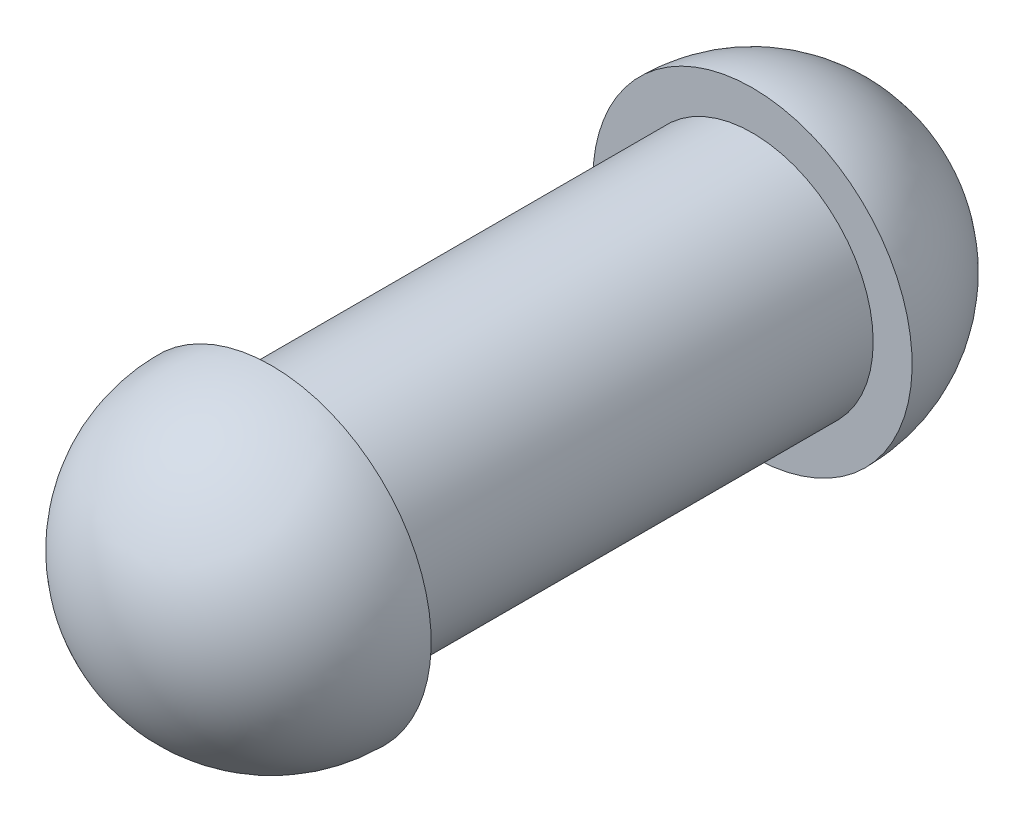
ISO-10303-21;
HEADER;
FILE_DESCRIPTION(('STEP AP214'),'2;1');
FILE_NAME('part.step','',(''),(''),'','','');
FILE_SCHEMA(('AUTOMOTIVE_DESIGN { 1 0 10303 214 1 1 1 1 }'));
ENDSEC;
DATA;
#1=APPLICATION_CONTEXT('core data for automotive mechanical design processes');
#2=APPLICATION_PROTOCOL_DEFINITION('international standard','automotive_design',2000,#1);
#3=PRODUCT_CONTEXT('',#1,'mechanical');
#4=PRODUCT('Part','Part','',(#3));
#5=PRODUCT_RELATED_PRODUCT_CATEGORY('part','',(#4));
#6=PRODUCT_DEFINITION_FORMATION('','',#4);
#7=PRODUCT_DEFINITION_CONTEXT('part definition',#1,'design');
#8=PRODUCT_DEFINITION('design','',#6,#7);
#9=PRODUCT_DEFINITION_SHAPE('','',#8);
#10=(LENGTH_UNIT() NAMED_UNIT(*) SI_UNIT(.MILLI.,.METRE.));
#11=(NAMED_UNIT(*) PLANE_ANGLE_UNIT() SI_UNIT($,.RADIAN.));
#12=(NAMED_UNIT(*) SI_UNIT($,.STERADIAN.) SOLID_ANGLE_UNIT());
#13=UNCERTAINTY_MEASURE_WITH_UNIT(LENGTH_MEASURE(1.E-05),#10,'distance_accuracy_value','');
#14=(GEOMETRIC_REPRESENTATION_CONTEXT(3) GLOBAL_UNCERTAINTY_ASSIGNED_CONTEXT((#13)) GLOBAL_UNIT_ASSIGNED_CONTEXT((#10,
#11,#12)) REPRESENTATION_CONTEXT('',''));
#15=CARTESIAN_POINT('',(0.,0.,0.));
#16=DIRECTION('',(0.,0.,1.));
#17=DIRECTION('',(1.,0.,0.));
#18=AXIS2_PLACEMENT_3D('',#15,#16,#17);
#19=CARTESIAN_POINT('',(0.,0.,30.875));
#20=DIRECTION('',(0.,0.,-1.));
#21=DIRECTION('',(-1.,0.,0.));
#22=AXIS2_PLACEMENT_3D('',#19,#20,#21);
#23=CYLINDRICAL_SURFACE('',#22,15.5);
#24=CARTESIAN_POINT('',(0.,0.,30.875));
#25=DIRECTION('',(0.,0.,1.));
#26=DIRECTION('',(1.,0.,0.));
#27=AXIS2_PLACEMENT_3D('',#24,#25,#26);
#28=CIRCLE('',#27,15.5);
#29=CARTESIAN_POINT('',(15.5,0.,30.875));
#30=VERTEX_POINT('',#29);
#31=EDGE_CURVE('E10',#30,#30,#28,.T.);
#32=ORIENTED_EDGE('',*,*,#31,.F.);
#33=EDGE_LOOP('',(#32));
#34=FACE_BOUND('',#33,.T.);
#35=CARTESIAN_POINT('',(0.,0.,-30.875));
#36=DIRECTION('',(0.,0.,1.));
#37=DIRECTION('',(1.,0.,0.));
#38=AXIS2_PLACEMENT_3D('',#35,#36,#37);
#39=CIRCLE('',#38,15.5);
#40=CARTESIAN_POINT('',(15.5,0.,-30.875));
#41=VERTEX_POINT('',#40);
#42=EDGE_CURVE('E47',#41,#41,#39,.T.);
#43=ORIENTED_EDGE('',*,*,#42,.T.);
#44=EDGE_LOOP('',(#43));
#45=FACE_BOUND('',#44,.T.);
#46=ADVANCED_FACE('F37',(#34,#45),#23,.T.);
#47=CARTESIAN_POINT('',(0.,0.,30.875));
#48=DIRECTION('',(0.,0.,-1.));
#49=DIRECTION('',(-1.,0.,0.));
#50=AXIS2_PLACEMENT_3D('',#47,#48,#49);
#51=PLANE('',#50);
#52=ORIENTED_EDGE('',*,*,#31,.T.);
#53=EDGE_LOOP('',(#52));
#54=FACE_BOUND('',#53,.T.);
#55=CARTESIAN_POINT('',(0.,0.,30.875));
#56=DIRECTION('',(0.,0.,-1.));
#57=DIRECTION('',(-1.,0.,0.));
#58=AXIS2_PLACEMENT_3D('',#55,#56,#57);
#59=CIRCLE('',#58,20.5);
#60=CARTESIAN_POINT('',(-20.5,0.,30.875));
#61=VERTEX_POINT('',#60);
#62=EDGE_CURVE('E43',#61,#61,#59,.T.);
#63=ORIENTED_EDGE('',*,*,#62,.T.);
#64=EDGE_LOOP('',(#63));
#65=FACE_BOUND('',#64,.T.);
#66=ADVANCED_FACE('F69',(#54,#65),#51,.T.);
#67=CARTESIAN_POINT('',(0.,0.,30.875));
#68=DIRECTION('',(0.,0.,-1.));
#69=DIRECTION('',(0.,1.,0.));
#70=AXIS2_PLACEMENT_3D('',#67,#68,#69);
#71=SPHERICAL_SURFACE('',#70,20.5);
#72=ORIENTED_EDGE('',*,*,#62,.F.);
#73=EDGE_LOOP('',(#72));
#74=FACE_BOUND('',#73,.T.);
#75=ADVANCED_FACE('F61',(#74),#71,.T.);
#76=CARTESIAN_POINT('',(0.,0.,-30.875));
#77=DIRECTION('',(0.,0.,1.));
#78=DIRECTION('',(-1.,0.,0.));
#79=AXIS2_PLACEMENT_3D('',#76,#77,#78);
#80=PLANE('',#79);
#81=ORIENTED_EDGE('',*,*,#42,.F.);
#82=EDGE_LOOP('',(#81));
#83=FACE_BOUND('',#82,.T.);
#84=CARTESIAN_POINT('',(0.,0.,-30.875));
#85=DIRECTION('',(0.,0.,-1.));
#86=DIRECTION('',(-1.,0.,0.));
#87=AXIS2_PLACEMENT_3D('',#84,#85,#86);
#88=CIRCLE('',#87,20.5);
#89=CARTESIAN_POINT('',(-20.5,0.,-30.875));
#90=VERTEX_POINT('',#89);
#91=EDGE_CURVE('E51',#90,#90,#88,.T.);
#92=ORIENTED_EDGE('',*,*,#91,.F.);
#93=EDGE_LOOP('',(#92));
#94=FACE_BOUND('',#93,.T.);
#95=ADVANCED_FACE('F59',(#83,#94),#80,.T.);
#96=CARTESIAN_POINT('',(0.,0.,-30.875));
#97=DIRECTION('',(0.,0.,1.));
#98=DIRECTION('',(0.,1.,0.));
#99=AXIS2_PLACEMENT_3D('',#96,#97,#98);
#100=SPHERICAL_SURFACE('',#99,20.5);
#101=ORIENTED_EDGE('',*,*,#91,.T.);
#102=EDGE_LOOP('',(#101));
#103=FACE_BOUND('',#102,.T.);
#104=ADVANCED_FACE('F57',(#103),#100,.T.);
#105=CLOSED_SHELL('',(#46,#66,#75,#95,#104));
#106=MANIFOLD_SOLID_BREP('B2',#105);
#107=ADVANCED_BREP_SHAPE_REPRESENTATION('',(#18,#106),#14);
#108=SHAPE_DEFINITION_REPRESENTATION(#9,#107);
ENDSEC;
END-ISO-10303-21;
